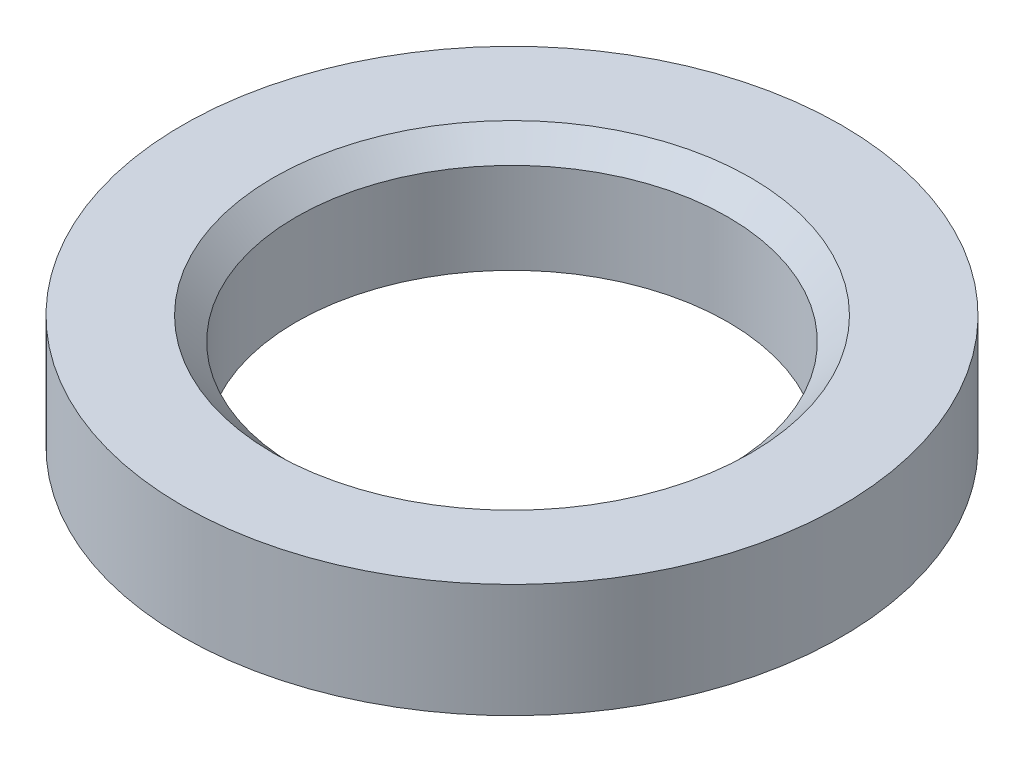
ISO-10303-21;
HEADER;
FILE_DESCRIPTION(('STEP AP214'),'2;1');
FILE_NAME('part.step','',(''),(''),'','','');
FILE_SCHEMA(('AUTOMOTIVE_DESIGN { 1 0 10303 214 1 1 1 1 }'));
ENDSEC;
DATA;
#1=APPLICATION_CONTEXT('core data for automotive mechanical design processes');
#2=APPLICATION_PROTOCOL_DEFINITION('international standard','automotive_design',2000,#1);
#3=PRODUCT_CONTEXT('',#1,'mechanical');
#4=PRODUCT('Part','Part','',(#3));
#5=PRODUCT_RELATED_PRODUCT_CATEGORY('part','',(#4));
#6=PRODUCT_DEFINITION_FORMATION('','',#4);
#7=PRODUCT_DEFINITION_CONTEXT('part definition',#1,'design');
#8=PRODUCT_DEFINITION('design','',#6,#7);
#9=PRODUCT_DEFINITION_SHAPE('','',#8);
#10=(LENGTH_UNIT() NAMED_UNIT(*) SI_UNIT(.MILLI.,.METRE.));
#11=(NAMED_UNIT(*) PLANE_ANGLE_UNIT() SI_UNIT($,.RADIAN.));
#12=(NAMED_UNIT(*) SI_UNIT($,.STERADIAN.) SOLID_ANGLE_UNIT());
#13=UNCERTAINTY_MEASURE_WITH_UNIT(LENGTH_MEASURE(1.E-05),#10,'distance_accuracy_value','');
#14=(GEOMETRIC_REPRESENTATION_CONTEXT(3) GLOBAL_UNCERTAINTY_ASSIGNED_CONTEXT((#13)) GLOBAL_UNIT_ASSIGNED_CONTEXT((#10,
#11,#12)) REPRESENTATION_CONTEXT('',''));
#15=CARTESIAN_POINT('',(0.,0.,0.));
#16=DIRECTION('',(0.,0.,1.));
#17=DIRECTION('',(1.,0.,0.));
#18=AXIS2_PLACEMENT_3D('',#15,#16,#17);
#19=CARTESIAN_POINT('',(0.,0.,0.));
#20=DIRECTION('',(0.,-1.,0.));
#21=DIRECTION('',(0.,0.,-1.));
#22=AXIS2_PLACEMENT_3D('',#19,#20,#21);
#23=CYLINDRICAL_SURFACE('',#22,9.5);
#24=CARTESIAN_POINT('',(0.,0.,0.));
#25=DIRECTION('',(0.,-1.,0.));
#26=DIRECTION('',(0.,0.,-1.));
#27=AXIS2_PLACEMENT_3D('',#24,#25,#26);
#28=CIRCLE('',#27,9.5);
#29=CARTESIAN_POINT('',(0.,0.,-9.5));
#30=VERTEX_POINT('',#29);
#31=EDGE_CURVE('E10',#30,#30,#28,.T.);
#32=ORIENTED_EDGE('',*,*,#31,.T.);
#33=EDGE_LOOP('',(#32));
#34=FACE_BOUND('',#33,.T.);
#35=CARTESIAN_POINT('',(0.,4.,0.));
#36=DIRECTION('',(0.,-1.,0.));
#37=DIRECTION('',(0.,0.,-1.));
#38=AXIS2_PLACEMENT_3D('',#35,#36,#37);
#39=CIRCLE('',#38,9.5);
#40=CARTESIAN_POINT('',(0.,4.,-9.5));
#41=VERTEX_POINT('',#40);
#42=EDGE_CURVE('E49',#41,#41,#39,.T.);
#43=ORIENTED_EDGE('',*,*,#42,.F.);
#44=EDGE_LOOP('',(#43));
#45=FACE_BOUND('',#44,.T.);
#46=ADVANCED_FACE('F30',(#34,#45),#23,.F.);
#47=CARTESIAN_POINT('',(9.5,0.,0.));
#48=DIRECTION('',(0.,-1.,0.));
#49=DIRECTION('',(0.,0.,-1.));
#50=AXIS2_PLACEMENT_3D('',#47,#48,#49);
#51=PLANE('',#50);
#52=CARTESIAN_POINT('',(0.,0.,0.));
#53=DIRECTION('',(0.,-1.,0.));
#54=DIRECTION('',(0.,0.,-1.));
#55=AXIS2_PLACEMENT_3D('',#52,#53,#54);
#56=CIRCLE('',#55,14.5);
#57=CARTESIAN_POINT('',(0.,0.,-14.5));
#58=VERTEX_POINT('',#57);
#59=EDGE_CURVE('E36',#58,#58,#56,.T.);
#60=ORIENTED_EDGE('',*,*,#59,.T.);
#61=EDGE_LOOP('',(#60));
#62=FACE_BOUND('',#61,.T.);
#63=ORIENTED_EDGE('',*,*,#31,.F.);
#64=EDGE_LOOP('',(#63));
#65=FACE_BOUND('',#64,.T.);
#66=ADVANCED_FACE('F57',(#62,#65),#51,.T.);
#67=CARTESIAN_POINT('',(0.,0.,0.));
#68=DIRECTION('',(0.,-1.,0.));
#69=DIRECTION('',(0.,0.,-1.));
#70=AXIS2_PLACEMENT_3D('',#67,#68,#69);
#71=CYLINDRICAL_SURFACE('',#70,14.5);
#72=CARTESIAN_POINT('',(0.,5.,0.));
#73=DIRECTION('',(0.,-1.,0.));
#74=DIRECTION('',(0.,0.,-1.));
#75=AXIS2_PLACEMENT_3D('',#72,#73,#74);
#76=CIRCLE('',#75,14.5);
#77=CARTESIAN_POINT('',(0.,5.,-14.5));
#78=VERTEX_POINT('',#77);
#79=EDGE_CURVE('E40',#78,#78,#76,.T.);
#80=ORIENTED_EDGE('',*,*,#79,.T.);
#81=EDGE_LOOP('',(#80));
#82=FACE_BOUND('',#81,.T.);
#83=ORIENTED_EDGE('',*,*,#59,.F.);
#84=EDGE_LOOP('',(#83));
#85=FACE_BOUND('',#84,.T.);
#86=ADVANCED_FACE('F61',(#82,#85),#71,.T.);
#87=CARTESIAN_POINT('',(14.5,5.,0.));
#88=DIRECTION('',(0.,1.,0.));
#89=DIRECTION('',(0.,0.,1.));
#90=AXIS2_PLACEMENT_3D('',#87,#88,#89);
#91=PLANE('',#90);
#92=CARTESIAN_POINT('',(0.,5.,0.));
#93=DIRECTION('',(0.,-1.,0.));
#94=DIRECTION('',(0.,0.,-1.));
#95=AXIS2_PLACEMENT_3D('',#92,#93,#94);
#96=CIRCLE('',#95,10.5);
#97=CARTESIAN_POINT('',(0.,5.,-10.5));
#98=VERTEX_POINT('',#97);
#99=EDGE_CURVE('E44',#98,#98,#96,.T.);
#100=ORIENTED_EDGE('',*,*,#99,.T.);
#101=EDGE_LOOP('',(#100));
#102=FACE_BOUND('',#101,.T.);
#103=ORIENTED_EDGE('',*,*,#79,.F.);
#104=EDGE_LOOP('',(#103));
#105=FACE_BOUND('',#104,.T.);
#106=ADVANCED_FACE('F65',(#102,#105),#91,.T.);
#107=CARTESIAN_POINT('',(0.,5.,0.));
#108=DIRECTION('',(0.,1.,0.));
#109=DIRECTION('',(0.,0.,1.));
#110=AXIS2_PLACEMENT_3D('',#107,#108,#109);
#111=CONICAL_SURFACE('',#110,10.5,0.785398163397448);
#112=ORIENTED_EDGE('',*,*,#42,.T.);
#113=EDGE_LOOP('',(#112));
#114=FACE_BOUND('',#113,.T.);
#115=ORIENTED_EDGE('',*,*,#99,.F.);
#116=EDGE_LOOP('',(#115));
#117=FACE_BOUND('',#116,.T.);
#118=ADVANCED_FACE('F53',(#114,#117),#111,.F.);
#119=CLOSED_SHELL('',(#46,#66,#86,#106,#118));
#120=MANIFOLD_SOLID_BREP('B2',#119);
#121=ADVANCED_BREP_SHAPE_REPRESENTATION('',(#18,#120),#14);
#122=SHAPE_DEFINITION_REPRESENTATION(#9,#121);
ENDSEC;
END-ISO-10303-21;
